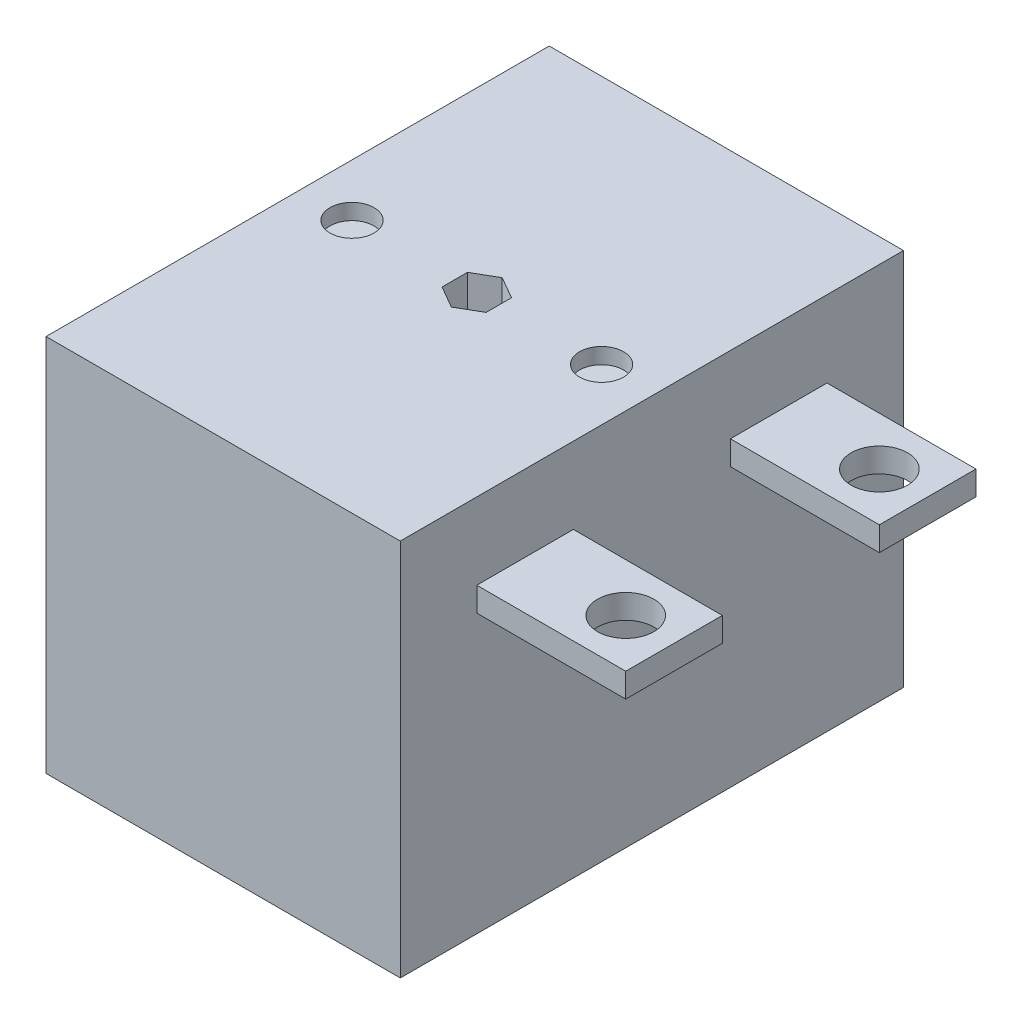
ISO-10303-21;
HEADER;
FILE_DESCRIPTION(('STEP AP214'),'2;1');
FILE_NAME('part.step','',(''),(''),'','','');
FILE_SCHEMA(('AUTOMOTIVE_DESIGN { 1 0 10303 214 1 1 1 1 }'));
ENDSEC;
DATA;
#1=APPLICATION_CONTEXT('core data for automotive mechanical design processes');
#2=APPLICATION_PROTOCOL_DEFINITION('international standard','automotive_design',2000,#1);
#3=PRODUCT_CONTEXT('',#1,'mechanical');
#4=PRODUCT('Part','Part','',(#3));
#5=PRODUCT_RELATED_PRODUCT_CATEGORY('part','',(#4));
#6=PRODUCT_DEFINITION_FORMATION('','',#4);
#7=PRODUCT_DEFINITION_CONTEXT('part definition',#1,'design');
#8=PRODUCT_DEFINITION('design','',#6,#7);
#9=PRODUCT_DEFINITION_SHAPE('','',#8);
#10=(LENGTH_UNIT() NAMED_UNIT(*) SI_UNIT(.MILLI.,.METRE.));
#11=(NAMED_UNIT(*) PLANE_ANGLE_UNIT() SI_UNIT($,.RADIAN.));
#12=(NAMED_UNIT(*) SI_UNIT($,.STERADIAN.) SOLID_ANGLE_UNIT());
#13=UNCERTAINTY_MEASURE_WITH_UNIT(LENGTH_MEASURE(1.E-05),#10,'distance_accuracy_value','');
#14=(GEOMETRIC_REPRESENTATION_CONTEXT(3) GLOBAL_UNCERTAINTY_ASSIGNED_CONTEXT((#13)) GLOBAL_UNIT_ASSIGNED_CONTEXT((#10,
#11,#12)) REPRESENTATION_CONTEXT('',''));
#15=CARTESIAN_POINT('',(0.,0.,0.));
#16=DIRECTION('',(0.,0.,1.));
#17=DIRECTION('',(1.,0.,0.));
#18=AXIS2_PLACEMENT_3D('',#15,#16,#17);
#19=CARTESIAN_POINT('',(22.352,0.,31.75));
#20=DIRECTION('',(-1.,0.,0.));
#21=DIRECTION('',(0.,-1.,0.));
#22=AXIS2_PLACEMENT_3D('',#19,#20,#21);
#23=PLANE('',#22);
#24=DIRECTION('',(0.,-1.,0.));
#25=VECTOR('',#24,1.);
#26=CARTESIAN_POINT('',(22.352,19.05,26.924));
#27=LINE('',#26,#25);
#28=CARTESIAN_POINT('',(22.352,19.05,26.924));
#29=VERTEX_POINT('',#28);
#30=CARTESIAN_POINT('',(22.352,17.526,26.924));
#31=VERTEX_POINT('',#30);
#32=EDGE_CURVE('E180',#29,#31,#27,.T.);
#33=ORIENTED_EDGE('',*,*,#32,.F.);
#34=DIRECTION('',(0.,0.,1.));
#35=VECTOR('',#34,1.);
#36=CARTESIAN_POINT('',(22.352,19.05,26.924));
#37=LINE('',#36,#35);
#38=CARTESIAN_POINT('',(22.352,19.05,20.828));
#39=VERTEX_POINT('',#38);
#40=EDGE_CURVE('E193',#39,#29,#37,.T.);
#41=ORIENTED_EDGE('',*,*,#40,.F.);
#42=DIRECTION('',(0.,1.,0.));
#43=VECTOR('',#42,1.);
#44=CARTESIAN_POINT('',(22.352,19.05,20.828));
#45=LINE('',#44,#43);
#46=CARTESIAN_POINT('',(22.352,17.526,20.828));
#47=VERTEX_POINT('',#46);
#48=EDGE_CURVE('E202',#47,#39,#45,.T.);
#49=ORIENTED_EDGE('',*,*,#48,.F.);
#50=DIRECTION('',(0.,0.,-1.));
#51=VECTOR('',#50,1.);
#52=CARTESIAN_POINT('',(22.352,17.526,26.924));
#53=LINE('',#52,#51);
#54=EDGE_CURVE('E183',#31,#47,#53,.T.);
#55=ORIENTED_EDGE('',*,*,#54,.F.);
#56=EDGE_LOOP('',(#33,#41,#49,#55));
#57=FACE_BOUND('',#56,.T.);
#58=DIRECTION('',(0.,1.,0.));
#59=VECTOR('',#58,1.);
#60=CARTESIAN_POINT('',(22.352,0.,0.));
#61=LINE('',#60,#59);
#62=CARTESIAN_POINT('',(22.352,0.,0.));
#63=VERTEX_POINT('',#62);
#64=CARTESIAN_POINT('',(22.352,23.876,0.));
#65=VERTEX_POINT('',#64);
#66=EDGE_CURVE('E294',#63,#65,#61,.T.);
#67=ORIENTED_EDGE('',*,*,#66,.T.);
#68=DIRECTION('',(0.,0.,-1.));
#69=VECTOR('',#68,1.);
#70=CARTESIAN_POINT('',(22.352,23.876,31.75));
#71=LINE('',#70,#69);
#72=CARTESIAN_POINT('',(22.352,23.876,31.75));
#73=VERTEX_POINT('',#72);
#74=EDGE_CURVE('E42',#73,#65,#71,.T.);
#75=ORIENTED_EDGE('',*,*,#74,.F.);
#76=DIRECTION('',(0.,1.,0.));
#77=VECTOR('',#76,1.);
#78=CARTESIAN_POINT('',(22.352,0.,31.75));
#79=LINE('',#78,#77);
#80=CARTESIAN_POINT('',(22.352,0.,31.75));
#81=VERTEX_POINT('',#80);
#82=EDGE_CURVE('E282',#81,#73,#79,.T.);
#83=ORIENTED_EDGE('',*,*,#82,.F.);
#84=DIRECTION('',(0.,0.,-1.));
#85=VECTOR('',#84,1.);
#86=CARTESIAN_POINT('',(22.352,0.,31.75));
#87=LINE('',#86,#85);
#88=EDGE_CURVE('E11',#81,#63,#87,.T.);
#89=ORIENTED_EDGE('',*,*,#88,.T.);
#90=EDGE_LOOP('',(#67,#75,#83,#89));
#91=FACE_BOUND('',#90,.T.);
#92=DIRECTION('',(0.,-1.,0.));
#93=VECTOR('',#92,1.);
#94=CARTESIAN_POINT('',(22.352,19.05,10.922));
#95=LINE('',#94,#93);
#96=CARTESIAN_POINT('',(22.352,19.05,10.922));
#97=VERTEX_POINT('',#96);
#98=CARTESIAN_POINT('',(22.352,17.526,10.922));
#99=VERTEX_POINT('',#98);
#100=EDGE_CURVE('E179',#97,#99,#95,.T.);
#101=ORIENTED_EDGE('',*,*,#100,.F.);
#102=DIRECTION('',(0.,0.,1.));
#103=VECTOR('',#102,1.);
#104=CARTESIAN_POINT('',(22.352,19.05,10.922));
#105=LINE('',#104,#103);
#106=CARTESIAN_POINT('',(22.352,19.05,4.826));
#107=VERTEX_POINT('',#106);
#108=EDGE_CURVE('E176',#107,#97,#105,.T.);
#109=ORIENTED_EDGE('',*,*,#108,.F.);
#110=DIRECTION('',(0.,1.,0.));
#111=VECTOR('',#110,1.);
#112=CARTESIAN_POINT('',(22.352,19.05,4.826));
#113=LINE('',#112,#111);
#114=CARTESIAN_POINT('',(22.352,17.526,4.826));
#115=VERTEX_POINT('',#114);
#116=EDGE_CURVE('E54',#115,#107,#113,.T.);
#117=ORIENTED_EDGE('',*,*,#116,.F.);
#118=DIRECTION('',(0.,0.,-1.));
#119=VECTOR('',#118,1.);
#120=CARTESIAN_POINT('',(22.352,17.526,10.922));
#121=LINE('',#120,#119);
#122=EDGE_CURVE('E49',#99,#115,#121,.T.);
#123=ORIENTED_EDGE('',*,*,#122,.F.);
#124=EDGE_LOOP('',(#101,#109,#117,#123));
#125=FACE_BOUND('',#124,.T.);
#126=ADVANCED_FACE('F34',(#57,#91,#125),#23,.F.);
#127=CARTESIAN_POINT('',(0.,0.,31.75));
#128=DIRECTION('',(0.,1.,0.));
#129=DIRECTION('',(0.,0.,1.));
#130=AXIS2_PLACEMENT_3D('',#127,#128,#129);
#131=PLANE('',#130);
#132=DIRECTION('',(1.,0.,0.));
#133=VECTOR('',#132,1.);
#134=CARTESIAN_POINT('',(0.,0.,0.));
#135=LINE('',#134,#133);
#136=CARTESIAN_POINT('',(0.,0.,0.));
#137=VERTEX_POINT('',#136);
#138=EDGE_CURVE('E268',#137,#63,#135,.T.);
#139=ORIENTED_EDGE('',*,*,#138,.T.);
#140=ORIENTED_EDGE('',*,*,#88,.F.);
#141=DIRECTION('',(1.,0.,0.));
#142=VECTOR('',#141,1.);
#143=CARTESIAN_POINT('',(0.,0.,31.75));
#144=LINE('',#143,#142);
#145=CARTESIAN_POINT('',(0.,0.,31.75));
#146=VERTEX_POINT('',#145);
#147=EDGE_CURVE('E279',#146,#81,#144,.T.);
#148=ORIENTED_EDGE('',*,*,#147,.F.);
#149=DIRECTION('',(0.,0.,-1.));
#150=VECTOR('',#149,1.);
#151=CARTESIAN_POINT('',(0.,0.,31.75));
#152=LINE('',#151,#150);
#153=EDGE_CURVE('E291',#146,#137,#152,.T.);
#154=ORIENTED_EDGE('',*,*,#153,.T.);
#155=EDGE_LOOP('',(#139,#140,#148,#154));
#156=FACE_BOUND('',#155,.T.);
#157=ADVANCED_FACE('F36',(#156),#131,.F.);
#158=CARTESIAN_POINT('',(0.,23.876,31.75));
#159=DIRECTION('',(0.,1.,0.));
#160=DIRECTION('',(0.,0.,1.));
#161=AXIS2_PLACEMENT_3D('',#158,#159,#160);
#162=PLANE('',#161);
#163=CARTESIAN_POINT('',(19.05,23.876,15.748));
#164=DIRECTION('',(0.,1.,0.));
#165=DIRECTION('',(0.,0.,1.));
#166=AXIS2_PLACEMENT_3D('',#163,#164,#165);
#167=CIRCLE('',#166,1.38906250000001);
#168=CARTESIAN_POINT('',(19.05,23.876,17.1370625));
#169=VERTEX_POINT('',#168);
#170=EDGE_CURVE('E223',#169,#169,#167,.T.);
#171=ORIENTED_EDGE('',*,*,#170,.F.);
#172=EDGE_LOOP('',(#171));
#173=FACE_BOUND('',#172,.T.);
#174=CARTESIAN_POINT('',(3.302,23.876,15.748));
#175=DIRECTION('',(0.,1.,0.));
#176=DIRECTION('',(0.,0.,1.));
#177=AXIS2_PLACEMENT_3D('',#174,#175,#176);
#178=CIRCLE('',#177,1.38906250000001);
#179=CARTESIAN_POINT('',(3.302,23.876,17.1370625));
#180=VERTEX_POINT('',#179);
#181=EDGE_CURVE('E218',#180,#180,#178,.T.);
#182=ORIENTED_EDGE('',*,*,#181,.F.);
#183=EDGE_LOOP('',(#182));
#184=FACE_BOUND('',#183,.T.);
#185=DIRECTION('',(0.,0.,1.));
#186=VECTOR('',#185,1.);
#187=CARTESIAN_POINT('',(9.78693749999998,23.876,0.));
#188=LINE('',#187,#186);
#189=CARTESIAN_POINT('',(9.78693749999998,23.876,14.9460243917038));
#190=VERTEX_POINT('',#189);
#191=CARTESIAN_POINT('',(9.78693749999998,23.876,16.5499756082962));
#192=VERTEX_POINT('',#191);
#193=EDGE_CURVE('E222',#190,#192,#188,.T.);
#194=ORIENTED_EDGE('',*,*,#193,.F.);
#195=DIRECTION('',(-0.866025403784439,0.,0.5));
#196=VECTOR('',#195,1.);
#197=CARTESIAN_POINT('',(8.91855277939867,23.876,15.4473865439031));
#198=LINE('',#197,#196);
#199=CARTESIAN_POINT('',(11.176,23.876,14.1440487834076));
#200=VERTEX_POINT('',#199);
#201=EDGE_CURVE('E235',#200,#190,#198,.T.);
#202=ORIENTED_EDGE('',*,*,#201,.F.);
#203=DIRECTION('',(-0.866025403784438,0.,-0.5));
#204=VECTOR('',#203,1.);
#205=CARTESIAN_POINT('',(-3.33055277939866,23.876,5.76868663120822));
#206=LINE('',#205,#204);
#207=CARTESIAN_POINT('',(12.5650625,23.876,14.9460243917038));
#208=VERTEX_POINT('',#207);
#209=EDGE_CURVE('E261',#208,#200,#206,.T.);
#210=ORIENTED_EDGE('',*,*,#209,.F.);
#211=DIRECTION('',(0.,0.,-1.));
#212=VECTOR('',#211,1.);
#213=CARTESIAN_POINT('',(12.5650625,23.876,0.));
#214=LINE('',#213,#212);
#215=CARTESIAN_POINT('',(12.5650625,23.876,16.5499756082962));
#216=VERTEX_POINT('',#215);
#217=EDGE_CURVE('E258',#216,#208,#214,.T.);
#218=ORIENTED_EDGE('',*,*,#217,.F.);
#219=DIRECTION('',(0.866025403784439,0.,-0.5));
#220=VECTOR('',#219,1.);
#221=CARTESIAN_POINT('',(10.3076152793987,23.876,17.8533133687918));
#222=LINE('',#221,#220);
#223=CARTESIAN_POINT('',(11.176,23.876,17.3519512165924));
#224=VERTEX_POINT('',#223);
#225=EDGE_CURVE('E255',#224,#216,#222,.T.);
#226=ORIENTED_EDGE('',*,*,#225,.F.);
#227=DIRECTION('',(0.86602540378444,0.,0.499999999999999));
#228=VECTOR('',#227,1.);
#229=CARTESIAN_POINT('',(-4.71961527939868,23.876,8.17461345609692));
#230=LINE('',#229,#228);
#231=EDGE_CURVE('E252',#192,#224,#230,.T.);
#232=ORIENTED_EDGE('',*,*,#231,.F.);
#233=EDGE_LOOP('',(#194,#202,#210,#218,#226,#232));
#234=FACE_BOUND('',#233,.T.);
#235=DIRECTION('',(1.,0.,0.));
#236=VECTOR('',#235,1.);
#237=CARTESIAN_POINT('',(0.,23.876,0.));
#238=LINE('',#237,#236);
#239=CARTESIAN_POINT('',(0.,23.876,0.));
#240=VERTEX_POINT('',#239);
#241=EDGE_CURVE('E297',#240,#65,#238,.T.);
#242=ORIENTED_EDGE('',*,*,#241,.F.);
#243=DIRECTION('',(0.,0.,-1.));
#244=VECTOR('',#243,1.);
#245=CARTESIAN_POINT('',(0.,23.876,31.75));
#246=LINE('',#245,#244);
#247=CARTESIAN_POINT('',(0.,23.876,31.75));
#248=VERTEX_POINT('',#247);
#249=EDGE_CURVE('E303',#248,#240,#246,.T.);
#250=ORIENTED_EDGE('',*,*,#249,.F.);
#251=DIRECTION('',(1.,0.,0.));
#252=VECTOR('',#251,1.);
#253=CARTESIAN_POINT('',(0.,23.876,31.75));
#254=LINE('',#253,#252);
#255=EDGE_CURVE('E285',#248,#73,#254,.T.);
#256=ORIENTED_EDGE('',*,*,#255,.T.);
#257=ORIENTED_EDGE('',*,*,#74,.T.);
#258=EDGE_LOOP('',(#242,#250,#256,#257));
#259=FACE_BOUND('',#258,.T.);
#260=ADVANCED_FACE('F307',(#173,#184,#234,#259),#162,.T.);
#261=CARTESIAN_POINT('',(0.,0.,31.75));
#262=DIRECTION('',(-1.,0.,0.));
#263=DIRECTION('',(0.,-1.,0.));
#264=AXIS2_PLACEMENT_3D('',#261,#262,#263);
#265=PLANE('',#264);
#266=DIRECTION('',(0.,1.,0.));
#267=VECTOR('',#266,1.);
#268=CARTESIAN_POINT('',(0.,0.,0.));
#269=LINE('',#268,#267);
#270=EDGE_CURVE('E283',#137,#240,#269,.T.);
#271=ORIENTED_EDGE('',*,*,#270,.F.);
#272=ORIENTED_EDGE('',*,*,#153,.F.);
#273=DIRECTION('',(0.,1.,0.));
#274=VECTOR('',#273,1.);
#275=CARTESIAN_POINT('',(0.,0.,31.75));
#276=LINE('',#275,#274);
#277=EDGE_CURVE('E288',#146,#248,#276,.T.);
#278=ORIENTED_EDGE('',*,*,#277,.T.);
#279=ORIENTED_EDGE('',*,*,#249,.T.);
#280=EDGE_LOOP('',(#271,#272,#278,#279));
#281=FACE_BOUND('',#280,.T.);
#282=ADVANCED_FACE('F316',(#281),#265,.T.);
#283=CARTESIAN_POINT('',(0.,0.,31.75));
#284=DIRECTION('',(0.,0.,1.));
#285=DIRECTION('',(1.,0.,0.));
#286=AXIS2_PLACEMENT_3D('',#283,#284,#285);
#287=PLANE('',#286);
#288=ORIENTED_EDGE('',*,*,#147,.T.);
#289=ORIENTED_EDGE('',*,*,#82,.T.);
#290=ORIENTED_EDGE('',*,*,#255,.F.);
#291=ORIENTED_EDGE('',*,*,#277,.F.);
#292=EDGE_LOOP('',(#288,#289,#290,#291));
#293=FACE_BOUND('',#292,.T.);
#294=ADVANCED_FACE('F320',(#293),#287,.T.);
#295=CARTESIAN_POINT('',(0.,0.,0.));
#296=DIRECTION('',(0.,0.,1.));
#297=DIRECTION('',(1.,0.,0.));
#298=AXIS2_PLACEMENT_3D('',#295,#296,#297);
#299=PLANE('',#298);
#300=ORIENTED_EDGE('',*,*,#138,.F.);
#301=ORIENTED_EDGE('',*,*,#270,.T.);
#302=ORIENTED_EDGE('',*,*,#241,.T.);
#303=ORIENTED_EDGE('',*,*,#66,.F.);
#304=EDGE_LOOP('',(#300,#301,#302,#303));
#305=FACE_BOUND('',#304,.T.);
#306=ADVANCED_FACE('F313',(#305),#299,.F.);
#307=CARTESIAN_POINT('',(9.78693749999998,19.304,0.));
#308=DIRECTION('',(-1.,0.,0.));
#309=DIRECTION('',(0.,0.,1.));
#310=AXIS2_PLACEMENT_3D('',#307,#308,#309);
#311=PLANE('',#310);
#312=ORIENTED_EDGE('',*,*,#193,.T.);
#313=DIRECTION('',(0.,1.,0.));
#314=VECTOR('',#313,1.);
#315=CARTESIAN_POINT('',(9.78693749999998,19.304,16.5499756082962));
#316=LINE('',#315,#314);
#317=CARTESIAN_POINT('',(9.78693749999998,19.304,16.5499756082962));
#318=VERTEX_POINT('',#317);
#319=EDGE_CURVE('E250',#318,#192,#316,.T.);
#320=ORIENTED_EDGE('',*,*,#319,.F.);
#321=DIRECTION('',(0.,0.,1.));
#322=VECTOR('',#321,1.);
#323=CARTESIAN_POINT('',(9.78693749999998,19.304,0.));
#324=LINE('',#323,#322);
#325=CARTESIAN_POINT('',(9.78693749999998,19.304,14.9460243917038));
#326=VERTEX_POINT('',#325);
#327=EDGE_CURVE('E231',#326,#318,#324,.T.);
#328=ORIENTED_EDGE('',*,*,#327,.F.);
#329=DIRECTION('',(0.,1.,0.));
#330=VECTOR('',#329,1.);
#331=CARTESIAN_POINT('',(9.78693749999998,19.304,14.9460243917038));
#332=LINE('',#331,#330);
#333=EDGE_CURVE('E266',#326,#190,#332,.T.);
#334=ORIENTED_EDGE('',*,*,#333,.T.);
#335=EDGE_LOOP('',(#312,#320,#328,#334));
#336=FACE_BOUND('',#335,.T.);
#337=ADVANCED_FACE('F337',(#336),#311,.F.);
#338=CARTESIAN_POINT('',(8.91855277939867,19.304,15.4473865439031));
#339=DIRECTION('',(-0.5,0.,-0.866025403784438));
#340=DIRECTION('',(-0.866025403784439,0.,0.5));
#341=AXIS2_PLACEMENT_3D('',#338,#339,#340);
#342=PLANE('',#341);
#343=ORIENTED_EDGE('',*,*,#201,.T.);
#344=ORIENTED_EDGE('',*,*,#333,.F.);
#345=DIRECTION('',(-0.866025403784439,0.,0.5));
#346=VECTOR('',#345,1.);
#347=CARTESIAN_POINT('',(8.91855277939867,19.304,15.4473865439031));
#348=LINE('',#347,#346);
#349=CARTESIAN_POINT('',(11.176,19.304,14.1440487834076));
#350=VERTEX_POINT('',#349);
#351=EDGE_CURVE('E247',#350,#326,#348,.T.);
#352=ORIENTED_EDGE('',*,*,#351,.F.);
#353=DIRECTION('',(0.,1.,0.));
#354=VECTOR('',#353,1.);
#355=CARTESIAN_POINT('',(11.176,19.304,14.1440487834076));
#356=LINE('',#355,#354);
#357=EDGE_CURVE('E269',#350,#200,#356,.T.);
#358=ORIENTED_EDGE('',*,*,#357,.T.);
#359=EDGE_LOOP('',(#343,#344,#352,#358));
#360=FACE_BOUND('',#359,.T.);
#361=ADVANCED_FACE('F342',(#360),#342,.F.);
#362=CARTESIAN_POINT('',(-3.33055277939866,19.304,5.76868663120822));
#363=DIRECTION('',(0.5,0.,-0.866025403784438));
#364=DIRECTION('',(-0.866025403784439,0.,-0.5));
#365=AXIS2_PLACEMENT_3D('',#362,#363,#364);
#366=PLANE('',#365);
#367=ORIENTED_EDGE('',*,*,#209,.T.);
#368=ORIENTED_EDGE('',*,*,#357,.F.);
#369=DIRECTION('',(-0.866025403784438,0.,-0.5));
#370=VECTOR('',#369,1.);
#371=CARTESIAN_POINT('',(-3.33055277939866,19.304,5.76868663120822));
#372=LINE('',#371,#370);
#373=CARTESIAN_POINT('',(12.5650625,19.304,14.9460243917038));
#374=VERTEX_POINT('',#373);
#375=EDGE_CURVE('E244',#374,#350,#372,.T.);
#376=ORIENTED_EDGE('',*,*,#375,.F.);
#377=DIRECTION('',(0.,1.,0.));
#378=VECTOR('',#377,1.);
#379=CARTESIAN_POINT('',(12.5650625,19.304,14.9460243917038));
#380=LINE('',#379,#378);
#381=EDGE_CURVE('E271',#374,#208,#380,.T.);
#382=ORIENTED_EDGE('',*,*,#381,.T.);
#383=EDGE_LOOP('',(#367,#368,#376,#382));
#384=FACE_BOUND('',#383,.T.);
#385=ADVANCED_FACE('F356',(#384),#366,.F.);
#386=CARTESIAN_POINT('',(12.5650625,19.304,0.));
#387=DIRECTION('',(1.,0.,0.));
#388=DIRECTION('',(0.,0.,-1.));
#389=AXIS2_PLACEMENT_3D('',#386,#387,#388);
#390=PLANE('',#389);
#391=ORIENTED_EDGE('',*,*,#217,.T.);
#392=ORIENTED_EDGE('',*,*,#381,.F.);
#393=DIRECTION('',(0.,0.,-1.));
#394=VECTOR('',#393,1.);
#395=CARTESIAN_POINT('',(12.5650625,19.304,0.));
#396=LINE('',#395,#394);
#397=CARTESIAN_POINT('',(12.5650625,19.304,16.5499756082962));
#398=VERTEX_POINT('',#397);
#399=EDGE_CURVE('E241',#398,#374,#396,.T.);
#400=ORIENTED_EDGE('',*,*,#399,.F.);
#401=DIRECTION('',(0.,1.,0.));
#402=VECTOR('',#401,1.);
#403=CARTESIAN_POINT('',(12.5650625,19.304,16.5499756082962));
#404=LINE('',#403,#402);
#405=EDGE_CURVE('E273',#398,#216,#404,.T.);
#406=ORIENTED_EDGE('',*,*,#405,.T.);
#407=EDGE_LOOP('',(#391,#392,#400,#406));
#408=FACE_BOUND('',#407,.T.);
#409=ADVANCED_FACE('F352',(#408),#390,.F.);
#410=CARTESIAN_POINT('',(10.3076152793987,19.304,17.8533133687918));
#411=DIRECTION('',(0.5,0.,0.866025403784439));
#412=DIRECTION('',(0.866025403784439,0.,-0.5));
#413=AXIS2_PLACEMENT_3D('',#410,#411,#412);
#414=PLANE('',#413);
#415=ORIENTED_EDGE('',*,*,#225,.T.);
#416=ORIENTED_EDGE('',*,*,#405,.F.);
#417=DIRECTION('',(0.866025403784439,0.,-0.5));
#418=VECTOR('',#417,1.);
#419=CARTESIAN_POINT('',(10.3076152793987,19.304,17.8533133687918));
#420=LINE('',#419,#418);
#421=CARTESIAN_POINT('',(11.176,19.304,17.3519512165924));
#422=VERTEX_POINT('',#421);
#423=EDGE_CURVE('E238',#422,#398,#420,.T.);
#424=ORIENTED_EDGE('',*,*,#423,.F.);
#425=DIRECTION('',(0.,1.,0.));
#426=VECTOR('',#425,1.);
#427=CARTESIAN_POINT('',(11.176,19.304,17.3519512165924));
#428=LINE('',#427,#426);
#429=EDGE_CURVE('E275',#422,#224,#428,.T.);
#430=ORIENTED_EDGE('',*,*,#429,.T.);
#431=EDGE_LOOP('',(#415,#416,#424,#430));
#432=FACE_BOUND('',#431,.T.);
#433=ADVANCED_FACE('F348',(#432),#414,.F.);
#434=CARTESIAN_POINT('',(-4.71961527939868,19.304,8.17461345609692));
#435=DIRECTION('',(-0.499999999999999,0.,0.866025403784439));
#436=DIRECTION('',(0.86602540378444,0.,0.499999999999999));
#437=AXIS2_PLACEMENT_3D('',#434,#435,#436);
#438=PLANE('',#437);
#439=ORIENTED_EDGE('',*,*,#231,.T.);
#440=ORIENTED_EDGE('',*,*,#429,.F.);
#441=DIRECTION('',(0.86602540378444,0.,0.499999999999999));
#442=VECTOR('',#441,1.);
#443=CARTESIAN_POINT('',(-4.71961527939868,19.304,8.17461345609692));
#444=LINE('',#443,#442);
#445=EDGE_CURVE('E234',#318,#422,#444,.T.);
#446=ORIENTED_EDGE('',*,*,#445,.F.);
#447=ORIENTED_EDGE('',*,*,#319,.T.);
#448=EDGE_LOOP('',(#439,#440,#446,#447));
#449=FACE_BOUND('',#448,.T.);
#450=ADVANCED_FACE('F344',(#449),#438,.F.);
#451=CARTESIAN_POINT('',(0.,19.304,0.));
#452=DIRECTION('',(0.,1.,0.));
#453=DIRECTION('',(0.,0.,1.));
#454=AXIS2_PLACEMENT_3D('',#451,#452,#453);
#455=PLANE('',#454);
#456=ORIENTED_EDGE('',*,*,#327,.T.);
#457=ORIENTED_EDGE('',*,*,#445,.T.);
#458=ORIENTED_EDGE('',*,*,#423,.T.);
#459=ORIENTED_EDGE('',*,*,#399,.T.);
#460=ORIENTED_EDGE('',*,*,#375,.T.);
#461=ORIENTED_EDGE('',*,*,#351,.T.);
#462=EDGE_LOOP('',(#456,#457,#458,#459,#460,#461));
#463=FACE_BOUND('',#462,.T.);
#464=ADVANCED_FACE('F347',(#463),#455,.T.);
#465=CARTESIAN_POINT('',(3.302,22.876,15.748));
#466=DIRECTION('',(0.,1.,0.));
#467=DIRECTION('',(0.,0.,1.));
#468=AXIS2_PLACEMENT_3D('',#465,#466,#467);
#469=CYLINDRICAL_SURFACE('',#468,1.38906250000001);
#470=CARTESIAN_POINT('',(3.302,22.876,15.748));
#471=DIRECTION('',(0.,1.,0.));
#472=DIRECTION('',(0.,0.,1.));
#473=AXIS2_PLACEMENT_3D('',#470,#471,#472);
#474=CIRCLE('',#473,1.38906250000001);
#475=CARTESIAN_POINT('',(3.302,22.876,17.1370625));
#476=VERTEX_POINT('',#475);
#477=EDGE_CURVE('E226',#476,#476,#474,.T.);
#478=ORIENTED_EDGE('',*,*,#477,.F.);
#479=EDGE_LOOP('',(#478));
#480=FACE_BOUND('',#479,.T.);
#481=ORIENTED_EDGE('',*,*,#181,.T.);
#482=EDGE_LOOP('',(#481));
#483=FACE_BOUND('',#482,.T.);
#484=ADVANCED_FACE('F366',(#480,#483),#469,.F.);
#485=CARTESIAN_POINT('',(0.,22.876,0.));
#486=DIRECTION('',(0.,1.,0.));
#487=DIRECTION('',(0.,0.,1.));
#488=AXIS2_PLACEMENT_3D('',#485,#486,#487);
#489=PLANE('',#488);
#490=ORIENTED_EDGE('',*,*,#477,.T.);
#491=EDGE_LOOP('',(#490));
#492=FACE_BOUND('',#491,.T.);
#493=ADVANCED_FACE('F370',(#492),#489,.T.);
#494=CARTESIAN_POINT('',(19.05,22.876,15.748));
#495=DIRECTION('',(0.,1.,0.));
#496=DIRECTION('',(0.,0.,1.));
#497=AXIS2_PLACEMENT_3D('',#494,#495,#496);
#498=CYLINDRICAL_SURFACE('',#497,1.38906250000001);
#499=CARTESIAN_POINT('',(19.05,22.876,15.748));
#500=DIRECTION('',(0.,1.,0.));
#501=DIRECTION('',(0.,0.,1.));
#502=AXIS2_PLACEMENT_3D('',#499,#500,#501);
#503=CIRCLE('',#502,1.38906250000001);
#504=CARTESIAN_POINT('',(19.05,22.876,17.1370625));
#505=VERTEX_POINT('',#504);
#506=EDGE_CURVE('E219',#505,#505,#503,.T.);
#507=ORIENTED_EDGE('',*,*,#506,.F.);
#508=EDGE_LOOP('',(#507));
#509=FACE_BOUND('',#508,.T.);
#510=ORIENTED_EDGE('',*,*,#170,.T.);
#511=EDGE_LOOP('',(#510));
#512=FACE_BOUND('',#511,.T.);
#513=ADVANCED_FACE('F374',(#509,#512),#498,.F.);
#514=CARTESIAN_POINT('',(0.,22.876,0.));
#515=DIRECTION('',(0.,1.,0.));
#516=DIRECTION('',(0.,0.,1.));
#517=AXIS2_PLACEMENT_3D('',#514,#515,#516);
#518=PLANE('',#517);
#519=ORIENTED_EDGE('',*,*,#506,.T.);
#520=EDGE_LOOP('',(#519));
#521=FACE_BOUND('',#520,.T.);
#522=ADVANCED_FACE('F378',(#521),#518,.T.);
#523=CARTESIAN_POINT('',(31.75,19.05,26.924));
#524=DIRECTION('',(0.,0.,-1.));
#525=DIRECTION('',(0.,1.,0.));
#526=AXIS2_PLACEMENT_3D('',#523,#524,#525);
#527=PLANE('',#526);
#528=ORIENTED_EDGE('',*,*,#32,.T.);
#529=DIRECTION('',(-1.,0.,0.));
#530=VECTOR('',#529,1.);
#531=CARTESIAN_POINT('',(31.75,17.526,26.924));
#532=LINE('',#531,#530);
#533=CARTESIAN_POINT('',(31.75,17.526,26.924));
#534=VERTEX_POINT('',#533);
#535=EDGE_CURVE('E215',#534,#31,#532,.T.);
#536=ORIENTED_EDGE('',*,*,#535,.F.);
#537=DIRECTION('',(0.,-1.,0.));
#538=VECTOR('',#537,1.);
#539=CARTESIAN_POINT('',(31.75,19.05,26.924));
#540=LINE('',#539,#538);
#541=CARTESIAN_POINT('',(31.75,19.05,26.924));
#542=VERTEX_POINT('',#541);
#543=EDGE_CURVE('E189',#542,#534,#540,.T.);
#544=ORIENTED_EDGE('',*,*,#543,.F.);
#545=DIRECTION('',(-1.,0.,0.));
#546=VECTOR('',#545,1.);
#547=CARTESIAN_POINT('',(31.75,19.05,26.924));
#548=LINE('',#547,#546);
#549=EDGE_CURVE('E198',#542,#29,#548,.T.);
#550=ORIENTED_EDGE('',*,*,#549,.T.);
#551=EDGE_LOOP('',(#528,#536,#544,#550));
#552=FACE_BOUND('',#551,.T.);
#553=ADVANCED_FACE('F382',(#552),#527,.F.);
#554=CARTESIAN_POINT('',(31.75,17.526,26.924));
#555=DIRECTION('',(0.,1.,0.));
#556=DIRECTION('',(-1.,0.,0.));
#557=AXIS2_PLACEMENT_3D('',#554,#555,#556);
#558=PLANE('',#557);
#559=CARTESIAN_POINT('',(28.702,17.526,23.876));
#560=DIRECTION('',(0.,1.,0.));
#561=DIRECTION('',(-1.,0.,0.));
#562=AXIS2_PLACEMENT_3D('',#559,#560,#561);
#563=CIRCLE('',#562,1.778);
#564=CARTESIAN_POINT('',(26.924,17.526,23.876));
#565=VERTEX_POINT('',#564);
#566=EDGE_CURVE('E433',#565,#565,#563,.F.);
#567=ORIENTED_EDGE('',*,*,#566,.F.);
#568=EDGE_LOOP('',(#567));
#569=FACE_BOUND('',#568,.T.);
#570=ORIENTED_EDGE('',*,*,#54,.T.);
#571=DIRECTION('',(-1.,0.,0.));
#572=VECTOR('',#571,1.);
#573=CARTESIAN_POINT('',(31.75,17.526,20.828));
#574=LINE('',#573,#572);
#575=CARTESIAN_POINT('',(31.75,17.526,20.828));
#576=VERTEX_POINT('',#575);
#577=EDGE_CURVE('E212',#576,#47,#574,.T.);
#578=ORIENTED_EDGE('',*,*,#577,.F.);
#579=DIRECTION('',(0.,0.,-1.));
#580=VECTOR('',#579,1.);
#581=CARTESIAN_POINT('',(31.75,17.526,26.924));
#582=LINE('',#581,#580);
#583=EDGE_CURVE('E192',#534,#576,#582,.T.);
#584=ORIENTED_EDGE('',*,*,#583,.F.);
#585=ORIENTED_EDGE('',*,*,#535,.T.);
#586=EDGE_LOOP('',(#570,#578,#584,#585));
#587=FACE_BOUND('',#586,.T.);
#588=ADVANCED_FACE('F386',(#569,#587),#558,.F.);
#589=CARTESIAN_POINT('',(31.75,19.05,20.828));
#590=DIRECTION('',(0.,0.,1.));
#591=DIRECTION('',(1.,0.,0.));
#592=AXIS2_PLACEMENT_3D('',#589,#590,#591);
#593=PLANE('',#592);
#594=ORIENTED_EDGE('',*,*,#48,.T.);
#595=DIRECTION('',(-1.,0.,0.));
#596=VECTOR('',#595,1.);
#597=CARTESIAN_POINT('',(31.75,19.05,20.828));
#598=LINE('',#597,#596);
#599=CARTESIAN_POINT('',(31.75,19.05,20.828));
#600=VERTEX_POINT('',#599);
#601=EDGE_CURVE('E209',#600,#39,#598,.T.);
#602=ORIENTED_EDGE('',*,*,#601,.F.);
#603=DIRECTION('',(0.,1.,0.));
#604=VECTOR('',#603,1.);
#605=CARTESIAN_POINT('',(31.75,19.05,20.828));
#606=LINE('',#605,#604);
#607=EDGE_CURVE('E195',#576,#600,#606,.T.);
#608=ORIENTED_EDGE('',*,*,#607,.F.);
#609=ORIENTED_EDGE('',*,*,#577,.T.);
#610=EDGE_LOOP('',(#594,#602,#608,#609));
#611=FACE_BOUND('',#610,.T.);
#612=ADVANCED_FACE('F390',(#611),#593,.F.);
#613=CARTESIAN_POINT('',(31.75,19.05,26.924));
#614=DIRECTION('',(0.,-1.,0.));
#615=DIRECTION('',(0.,0.,-1.));
#616=AXIS2_PLACEMENT_3D('',#613,#614,#615);
#617=PLANE('',#616);
#618=CARTESIAN_POINT('',(28.702,19.05,23.876));
#619=DIRECTION('',(0.,1.,0.));
#620=DIRECTION('',(-1.,0.,0.));
#621=AXIS2_PLACEMENT_3D('',#618,#619,#620);
#622=CIRCLE('',#621,1.778);
#623=CARTESIAN_POINT('',(26.924,19.05,23.876));
#624=VERTEX_POINT('',#623);
#625=EDGE_CURVE('E430',#624,#624,#622,.T.);
#626=ORIENTED_EDGE('',*,*,#625,.F.);
#627=EDGE_LOOP('',(#626));
#628=FACE_BOUND('',#627,.T.);
#629=ORIENTED_EDGE('',*,*,#40,.T.);
#630=ORIENTED_EDGE('',*,*,#549,.F.);
#631=DIRECTION('',(0.,0.,1.));
#632=VECTOR('',#631,1.);
#633=CARTESIAN_POINT('',(31.75,19.05,26.924));
#634=LINE('',#633,#632);
#635=EDGE_CURVE('E197',#600,#542,#634,.T.);
#636=ORIENTED_EDGE('',*,*,#635,.F.);
#637=ORIENTED_EDGE('',*,*,#601,.T.);
#638=EDGE_LOOP('',(#629,#630,#636,#637));
#639=FACE_BOUND('',#638,.T.);
#640=ADVANCED_FACE('F394',(#628,#639),#617,.F.);
#641=CARTESIAN_POINT('',(31.75,0.,0.));
#642=DIRECTION('',(1.,0.,0.));
#643=DIRECTION('',(0.,1.,0.));
#644=AXIS2_PLACEMENT_3D('',#641,#642,#643);
#645=PLANE('',#644);
#646=ORIENTED_EDGE('',*,*,#543,.T.);
#647=ORIENTED_EDGE('',*,*,#583,.T.);
#648=ORIENTED_EDGE('',*,*,#607,.T.);
#649=ORIENTED_EDGE('',*,*,#635,.T.);
#650=EDGE_LOOP('',(#646,#647,#648,#649));
#651=FACE_BOUND('',#650,.T.);
#652=ADVANCED_FACE('F398',(#651),#645,.T.);
#653=CARTESIAN_POINT('',(31.75,19.05,10.922));
#654=DIRECTION('',(0.,0.,-1.));
#655=DIRECTION('',(0.,1.,0.));
#656=AXIS2_PLACEMENT_3D('',#653,#654,#655);
#657=PLANE('',#656);
#658=ORIENTED_EDGE('',*,*,#100,.T.);
#659=DIRECTION('',(-1.,0.,0.));
#660=VECTOR('',#659,1.);
#661=CARTESIAN_POINT('',(31.75,17.526,10.922));
#662=LINE('',#661,#660);
#663=CARTESIAN_POINT('',(31.75,17.526,10.922));
#664=VERTEX_POINT('',#663);
#665=EDGE_CURVE('E160',#664,#99,#662,.T.);
#666=ORIENTED_EDGE('',*,*,#665,.F.);
#667=DIRECTION('',(0.,-1.,0.));
#668=VECTOR('',#667,1.);
#669=CARTESIAN_POINT('',(31.75,19.05,10.922));
#670=LINE('',#669,#668);
#671=CARTESIAN_POINT('',(31.75,19.05,10.922));
#672=VERTEX_POINT('',#671);
#673=EDGE_CURVE('E167',#672,#664,#670,.T.);
#674=ORIENTED_EDGE('',*,*,#673,.F.);
#675=DIRECTION('',(-1.,0.,0.));
#676=VECTOR('',#675,1.);
#677=CARTESIAN_POINT('',(31.75,19.05,10.922));
#678=LINE('',#677,#676);
#679=EDGE_CURVE('E445',#672,#97,#678,.T.);
#680=ORIENTED_EDGE('',*,*,#679,.T.);
#681=EDGE_LOOP('',(#658,#666,#674,#680));
#682=FACE_BOUND('',#681,.T.);
#683=ADVANCED_FACE('F178',(#682),#657,.F.);
#684=CARTESIAN_POINT('',(31.75,17.526,10.922));
#685=DIRECTION('',(0.,1.,0.));
#686=DIRECTION('',(-1.,0.,0.));
#687=AXIS2_PLACEMENT_3D('',#684,#685,#686);
#688=PLANE('',#687);
#689=CARTESIAN_POINT('',(28.702,17.526,7.87400000000001));
#690=DIRECTION('',(0.,1.,0.));
#691=DIRECTION('',(-1.,0.,0.));
#692=AXIS2_PLACEMENT_3D('',#689,#690,#691);
#693=CIRCLE('',#692,1.778);
#694=CARTESIAN_POINT('',(26.924,17.526,7.87400000000001));
#695=VERTEX_POINT('',#694);
#696=EDGE_CURVE('E436',#695,#695,#693,.F.);
#697=ORIENTED_EDGE('',*,*,#696,.F.);
#698=EDGE_LOOP('',(#697));
#699=FACE_BOUND('',#698,.T.);
#700=ORIENTED_EDGE('',*,*,#122,.T.);
#701=DIRECTION('',(-1.,0.,0.));
#702=VECTOR('',#701,1.);
#703=CARTESIAN_POINT('',(31.75,17.526,4.826));
#704=LINE('',#703,#702);
#705=CARTESIAN_POINT('',(31.75,17.526,4.826));
#706=VERTEX_POINT('',#705);
#707=EDGE_CURVE('E163',#706,#115,#704,.T.);
#708=ORIENTED_EDGE('',*,*,#707,.F.);
#709=DIRECTION('',(0.,0.,-1.));
#710=VECTOR('',#709,1.);
#711=CARTESIAN_POINT('',(31.75,17.526,10.922));
#712=LINE('',#711,#710);
#713=EDGE_CURVE('E156',#664,#706,#712,.T.);
#714=ORIENTED_EDGE('',*,*,#713,.F.);
#715=ORIENTED_EDGE('',*,*,#665,.T.);
#716=EDGE_LOOP('',(#700,#708,#714,#715));
#717=FACE_BOUND('',#716,.T.);
#718=ADVANCED_FACE('F158',(#699,#717),#688,.F.);
#719=CARTESIAN_POINT('',(31.75,19.05,4.826));
#720=DIRECTION('',(0.,0.,1.));
#721=DIRECTION('',(1.,0.,0.));
#722=AXIS2_PLACEMENT_3D('',#719,#720,#721);
#723=PLANE('',#722);
#724=ORIENTED_EDGE('',*,*,#116,.T.);
#725=DIRECTION('',(-1.,0.,0.));
#726=VECTOR('',#725,1.);
#727=CARTESIAN_POINT('',(31.75,19.05,4.826));
#728=LINE('',#727,#726);
#729=CARTESIAN_POINT('',(31.75,19.05,4.826));
#730=VERTEX_POINT('',#729);
#731=EDGE_CURVE('E185',#730,#107,#728,.T.);
#732=ORIENTED_EDGE('',*,*,#731,.F.);
#733=DIRECTION('',(0.,1.,0.));
#734=VECTOR('',#733,1.);
#735=CARTESIAN_POINT('',(31.75,19.05,4.826));
#736=LINE('',#735,#734);
#737=EDGE_CURVE('E166',#706,#730,#736,.T.);
#738=ORIENTED_EDGE('',*,*,#737,.F.);
#739=ORIENTED_EDGE('',*,*,#707,.T.);
#740=EDGE_LOOP('',(#724,#732,#738,#739));
#741=FACE_BOUND('',#740,.T.);
#742=ADVANCED_FACE('F407',(#741),#723,.F.);
#743=CARTESIAN_POINT('',(31.75,19.05,10.922));
#744=DIRECTION('',(0.,-1.,0.));
#745=DIRECTION('',(1.,0.,0.));
#746=AXIS2_PLACEMENT_3D('',#743,#744,#745);
#747=PLANE('',#746);
#748=CARTESIAN_POINT('',(28.702,19.05,7.87400000000001));
#749=DIRECTION('',(0.,1.,0.));
#750=DIRECTION('',(-1.,0.,0.));
#751=AXIS2_PLACEMENT_3D('',#748,#749,#750);
#752=CIRCLE('',#751,1.778);
#753=CARTESIAN_POINT('',(26.924,19.05,7.87400000000001));
#754=VERTEX_POINT('',#753);
#755=EDGE_CURVE('E439',#754,#754,#752,.T.);
#756=ORIENTED_EDGE('',*,*,#755,.F.);
#757=EDGE_LOOP('',(#756));
#758=FACE_BOUND('',#757,.T.);
#759=ORIENTED_EDGE('',*,*,#108,.T.);
#760=ORIENTED_EDGE('',*,*,#679,.F.);
#761=DIRECTION('',(0.,0.,1.));
#762=VECTOR('',#761,1.);
#763=CARTESIAN_POINT('',(31.75,19.05,10.922));
#764=LINE('',#763,#762);
#765=EDGE_CURVE('E172',#730,#672,#764,.T.);
#766=ORIENTED_EDGE('',*,*,#765,.F.);
#767=ORIENTED_EDGE('',*,*,#731,.T.);
#768=EDGE_LOOP('',(#759,#760,#766,#767));
#769=FACE_BOUND('',#768,.T.);
#770=ADVANCED_FACE('F411',(#758,#769),#747,.F.);
#771=CARTESIAN_POINT('',(31.75,0.,0.));
#772=DIRECTION('',(1.,0.,0.));
#773=DIRECTION('',(0.,1.,0.));
#774=AXIS2_PLACEMENT_3D('',#771,#772,#773);
#775=PLANE('',#774);
#776=ORIENTED_EDGE('',*,*,#673,.T.);
#777=ORIENTED_EDGE('',*,*,#713,.T.);
#778=ORIENTED_EDGE('',*,*,#737,.T.);
#779=ORIENTED_EDGE('',*,*,#765,.T.);
#780=EDGE_LOOP('',(#776,#777,#778,#779));
#781=FACE_BOUND('',#780,.T.);
#782=ADVANCED_FACE('F170',(#781),#775,.T.);
#783=CARTESIAN_POINT('',(28.702,-0.001000000000001,7.87400000000001));
#784=DIRECTION('',(0.,1.,0.));
#785=DIRECTION('',(-1.,0.,0.));
#786=AXIS2_PLACEMENT_3D('',#783,#784,#785);
#787=CYLINDRICAL_SURFACE('',#786,1.778);
#788=ORIENTED_EDGE('',*,*,#755,.T.);
#789=EDGE_LOOP('',(#788));
#790=FACE_BOUND('',#789,.T.);
#791=ORIENTED_EDGE('',*,*,#696,.T.);
#792=EDGE_LOOP('',(#791));
#793=FACE_BOUND('',#792,.T.);
#794=ADVANCED_FACE('F418',(#790,#793),#787,.F.);
#795=CARTESIAN_POINT('',(28.702,-0.001000000000001,23.876));
#796=DIRECTION('',(0.,1.,0.));
#797=DIRECTION('',(-1.,0.,0.));
#798=AXIS2_PLACEMENT_3D('',#795,#796,#797);
#799=CYLINDRICAL_SURFACE('',#798,1.778);
#800=ORIENTED_EDGE('',*,*,#625,.T.);
#801=EDGE_LOOP('',(#800));
#802=FACE_BOUND('',#801,.T.);
#803=ORIENTED_EDGE('',*,*,#566,.T.);
#804=EDGE_LOOP('',(#803));
#805=FACE_BOUND('',#804,.T.);
#806=ADVANCED_FACE('F421',(#802,#805),#799,.F.);
#807=CLOSED_SHELL('',(#126,#157,#260,#282,#294,#306,#337,#361,#385,#409,#433,#450,#464,#484,
#493,#513,#522,#553,#588,#612,#640,#652,#683,#718,#742,#770,#782,#794,#806));
#808=MANIFOLD_SOLID_BREP('B2',#807);
#809=ADVANCED_BREP_SHAPE_REPRESENTATION('',(#18,#808),#14);
#810=SHAPE_DEFINITION_REPRESENTATION(#9,#809);
ENDSEC;
END-ISO-10303-21;
